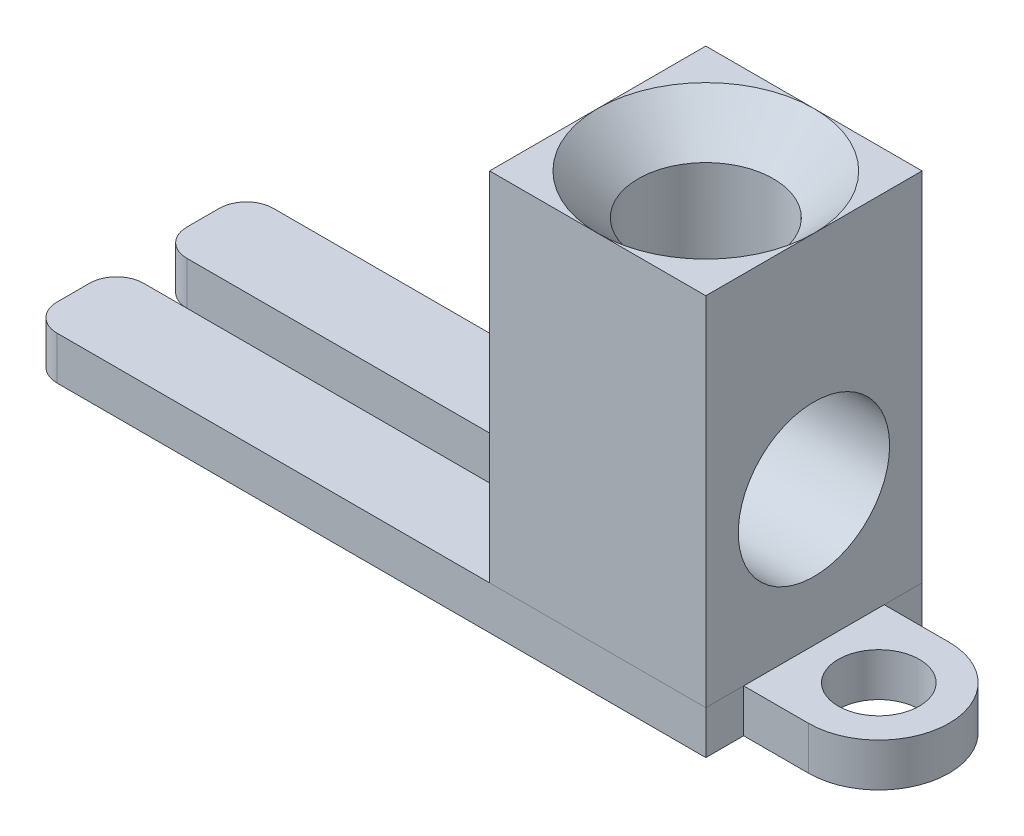
ISO-10303-21;
HEADER;
FILE_DESCRIPTION(('STEP AP214'),'2;1');
FILE_NAME('part.step','',(''),(''),'','','');
FILE_SCHEMA(('AUTOMOTIVE_DESIGN { 1 0 10303 214 1 1 1 1 }'));
ENDSEC;
DATA;
#1=APPLICATION_CONTEXT('core data for automotive mechanical design processes');
#2=APPLICATION_PROTOCOL_DEFINITION('international standard','automotive_design',2000,#1);
#3=PRODUCT_CONTEXT('',#1,'mechanical');
#4=PRODUCT('Part','Part','',(#3));
#5=PRODUCT_RELATED_PRODUCT_CATEGORY('part','',(#4));
#6=PRODUCT_DEFINITION_FORMATION('','',#4);
#7=PRODUCT_DEFINITION_CONTEXT('part definition',#1,'design');
#8=PRODUCT_DEFINITION('design','',#6,#7);
#9=PRODUCT_DEFINITION_SHAPE('','',#8);
#10=(LENGTH_UNIT() NAMED_UNIT(*) SI_UNIT(.MILLI.,.METRE.));
#11=(NAMED_UNIT(*) PLANE_ANGLE_UNIT() SI_UNIT($,.RADIAN.));
#12=(NAMED_UNIT(*) SI_UNIT($,.STERADIAN.) SOLID_ANGLE_UNIT());
#13=UNCERTAINTY_MEASURE_WITH_UNIT(LENGTH_MEASURE(1.E-05),#10,'distance_accuracy_value','');
#14=(GEOMETRIC_REPRESENTATION_CONTEXT(3) GLOBAL_UNCERTAINTY_ASSIGNED_CONTEXT((#13)) GLOBAL_UNIT_ASSIGNED_CONTEXT((#10,
#11,#12)) REPRESENTATION_CONTEXT('',''));
#15=CARTESIAN_POINT('',(0.,0.,0.));
#16=DIRECTION('',(0.,0.,1.));
#17=DIRECTION('',(1.,0.,0.));
#18=AXIS2_PLACEMENT_3D('',#15,#16,#17);
#19=CARTESIAN_POINT('',(-10.5,-0.8,-2.));
#20=DIRECTION('',(-1.,0.,0.));
#21=DIRECTION('',(0.,0.,1.));
#22=AXIS2_PLACEMENT_3D('',#19,#20,#21);
#23=PLANE('',#22);
#24=DIRECTION('',(0.,0.,1.));
#25=VECTOR('',#24,1.);
#26=CARTESIAN_POINT('',(-10.5,0.,-2.));
#27=LINE('',#26,#25);
#28=CARTESIAN_POINT('',(-10.5,0.,-1.5));
#29=VERTEX_POINT('',#28);
#30=CARTESIAN_POINT('',(-10.5,0.,-0.9));
#31=VERTEX_POINT('',#30);
#32=EDGE_CURVE('P0_E213',#29,#31,#27,.T.);
#33=ORIENTED_EDGE('',*,*,#32,.F.);
#34=DIRECTION('',(0.,1.,0.));
#35=VECTOR('',#34,1.);
#36=CARTESIAN_POINT('',(-10.5,-0.8,-1.5));
#37=LINE('',#36,#35);
#38=CARTESIAN_POINT('',(-10.5,-0.8,-1.5));
#39=VERTEX_POINT('',#38);
#40=EDGE_CURVE('P0_E25',#29,#39,#37,.F.);
#41=ORIENTED_EDGE('',*,*,#40,.T.);
#42=DIRECTION('',(0.,0.,1.));
#43=VECTOR('',#42,1.);
#44=CARTESIAN_POINT('',(-10.5,-0.8,-2.));
#45=LINE('',#44,#43);
#46=CARTESIAN_POINT('',(-10.5,-0.8,-0.9));
#47=VERTEX_POINT('',#46);
#48=EDGE_CURVE('P0_E189',#39,#47,#45,.T.);
#49=ORIENTED_EDGE('',*,*,#48,.T.);
#50=DIRECTION('',(0.,1.,0.));
#51=VECTOR('',#50,1.);
#52=CARTESIAN_POINT('',(-10.5,0.,-0.9));
#53=LINE('',#52,#51);
#54=EDGE_CURVE('P0_E255',#47,#31,#53,.T.);
#55=ORIENTED_EDGE('',*,*,#54,.T.);
#56=EDGE_LOOP('',(#33,#41,#49,#55));
#57=FACE_BOUND('',#56,.T.);
#58=ADVANCED_FACE('P0_F17',(#57),#23,.T.);
#59=CARTESIAN_POINT('',(2.,-0.8,1.3));
#60=DIRECTION('',(1.,0.,0.));
#61=DIRECTION('',(0.,0.,-1.));
#62=AXIS2_PLACEMENT_3D('',#59,#60,#61);
#63=PLANE('',#62);
#64=DIRECTION('',(0.,0.,-1.));
#65=VECTOR('',#64,1.);
#66=CARTESIAN_POINT('',(2.,0.,1.3));
#67=LINE('',#66,#65);
#68=CARTESIAN_POINT('',(2.,0.,2.));
#69=VERTEX_POINT('',#68);
#70=CARTESIAN_POINT('',(2.,0.,1.3));
#71=VERTEX_POINT('',#70);
#72=EDGE_CURVE('P0_E167',#69,#71,#67,.T.);
#73=ORIENTED_EDGE('',*,*,#72,.F.);
#74=DIRECTION('',(0.,1.,0.));
#75=VECTOR('',#74,1.);
#76=CARTESIAN_POINT('',(2.,-0.8,2.));
#77=LINE('',#76,#75);
#78=CARTESIAN_POINT('',(2.,-0.8,2.));
#79=VERTEX_POINT('',#78);
#80=EDGE_CURVE('P0_E217',#79,#69,#77,.T.);
#81=ORIENTED_EDGE('',*,*,#80,.F.);
#82=DIRECTION('',(0.,0.,-1.));
#83=VECTOR('',#82,1.);
#84=CARTESIAN_POINT('',(2.,-0.8,1.3));
#85=LINE('',#84,#83);
#86=CARTESIAN_POINT('',(2.,-0.8,1.3));
#87=VERTEX_POINT('',#86);
#88=EDGE_CURVE('P0_E170',#79,#87,#85,.T.);
#89=ORIENTED_EDGE('',*,*,#88,.T.);
#90=DIRECTION('',(0.,1.,0.));
#91=VECTOR('',#90,1.);
#92=CARTESIAN_POINT('',(2.,-0.8,1.3));
#93=LINE('',#92,#91);
#94=EDGE_CURVE('P0_E194',#87,#71,#93,.T.);
#95=ORIENTED_EDGE('',*,*,#94,.T.);
#96=EDGE_LOOP('',(#73,#81,#89,#95));
#97=FACE_BOUND('',#96,.T.);
#98=ADVANCED_FACE('P0_F291',(#97),#63,.T.);
#99=CARTESIAN_POINT('',(-10.5,-0.8,2.));
#100=DIRECTION('',(0.,0.,1.));
#101=DIRECTION('',(1.,0.,0.));
#102=AXIS2_PLACEMENT_3D('',#99,#100,#101);
#103=PLANE('',#102);
#104=DIRECTION('',(1.,0.,0.));
#105=VECTOR('',#104,1.);
#106=CARTESIAN_POINT('',(-10.5,0.,2.));
#107=LINE('',#106,#105);
#108=CARTESIAN_POINT('',(-10.,0.,2.));
#109=VERTEX_POINT('',#108);
#110=EDGE_CURVE('P0_E174',#109,#69,#107,.T.);
#111=ORIENTED_EDGE('',*,*,#110,.F.);
#112=DIRECTION('',(0.,1.,0.));
#113=VECTOR('',#112,1.);
#114=CARTESIAN_POINT('',(-10.,-0.8,2.));
#115=LINE('',#114,#113);
#116=CARTESIAN_POINT('',(-10.,-0.8,2.));
#117=VERTEX_POINT('',#116);
#118=EDGE_CURVE('P0_E242',#109,#117,#115,.F.);
#119=ORIENTED_EDGE('',*,*,#118,.T.);
#120=DIRECTION('',(1.,0.,0.));
#121=VECTOR('',#120,1.);
#122=CARTESIAN_POINT('',(-10.5,-0.8,2.));
#123=LINE('',#122,#121);
#124=EDGE_CURVE('P0_E192',#117,#79,#123,.T.);
#125=ORIENTED_EDGE('',*,*,#124,.T.);
#126=ORIENTED_EDGE('',*,*,#80,.T.);
#127=EDGE_LOOP('',(#111,#119,#125,#126));
#128=FACE_BOUND('',#127,.T.);
#129=ADVANCED_FACE('P0_F322',(#128),#103,.T.);
#130=CARTESIAN_POINT('',(-10.5,-0.8,0.9));
#131=VERTEX_POINT('',#130);
#132=CARTESIAN_POINT('',(-10.5,-0.8,1.5));
#133=VERTEX_POINT('',#132);
#134=EDGE_CURVE('P0_E188',#131,#133,#45,.T.);
#135=ORIENTED_EDGE('',*,*,#134,.T.);
#136=DIRECTION('',(0.,1.,0.));
#137=VECTOR('',#136,1.);
#138=CARTESIAN_POINT('',(-10.5,-0.8,1.5));
#139=LINE('',#138,#137);
#140=CARTESIAN_POINT('',(-10.5,0.,1.5));
#141=VERTEX_POINT('',#140);
#142=EDGE_CURVE('P0_E231',#133,#141,#139,.T.);
#143=ORIENTED_EDGE('',*,*,#142,.T.);
#144=CARTESIAN_POINT('',(-10.5,0.,0.9));
#145=VERTEX_POINT('',#144);
#146=EDGE_CURVE('P0_E212',#145,#141,#27,.T.);
#147=ORIENTED_EDGE('',*,*,#146,.F.);
#148=DIRECTION('',(0.,1.,0.));
#149=VECTOR('',#148,1.);
#150=CARTESIAN_POINT('',(-10.5,-0.8,0.9));
#151=LINE('',#150,#149);
#152=EDGE_CURVE('P0_E220',#145,#131,#151,.F.);
#153=ORIENTED_EDGE('',*,*,#152,.T.);
#154=EDGE_LOOP('',(#135,#143,#147,#153));
#155=FACE_BOUND('',#154,.T.);
#156=ADVANCED_FACE('P0_F302',(#155),#23,.T.);
#157=CARTESIAN_POINT('',(-10.5,-0.8,-2.));
#158=DIRECTION('',(0.,0.,-1.));
#159=DIRECTION('',(-1.,0.,0.));
#160=AXIS2_PLACEMENT_3D('',#157,#158,#159);
#161=PLANE('',#160);
#162=DIRECTION('',(-1.,0.,0.));
#163=VECTOR('',#162,1.);
#164=CARTESIAN_POINT('',(-10.5,-0.8,-2.));
#165=LINE('',#164,#163);
#166=CARTESIAN_POINT('',(2.,-0.8,-2.));
#167=VERTEX_POINT('',#166);
#168=CARTESIAN_POINT('',(-10.,-0.8,-2.));
#169=VERTEX_POINT('',#168);
#170=EDGE_CURVE('P0_E186',#167,#169,#165,.T.);
#171=ORIENTED_EDGE('',*,*,#170,.T.);
#172=DIRECTION('',(0.,1.,0.));
#173=VECTOR('',#172,1.);
#174=CARTESIAN_POINT('',(-10.,-0.8,-2.));
#175=LINE('',#174,#173);
#176=CARTESIAN_POINT('',(-10.,0.,-2.));
#177=VERTEX_POINT('',#176);
#178=EDGE_CURVE('P0_E252',#169,#177,#175,.T.);
#179=ORIENTED_EDGE('',*,*,#178,.T.);
#180=DIRECTION('',(-1.,0.,0.));
#181=VECTOR('',#180,1.);
#182=CARTESIAN_POINT('',(-10.5,0.,-2.));
#183=LINE('',#182,#181);
#184=CARTESIAN_POINT('',(2.,0.,-2.));
#185=VERTEX_POINT('',#184);
#186=EDGE_CURVE('P0_E209',#185,#177,#183,.T.);
#187=ORIENTED_EDGE('',*,*,#186,.F.);
#188=DIRECTION('',(0.,1.,0.));
#189=VECTOR('',#188,1.);
#190=CARTESIAN_POINT('',(2.,-0.8,-2.));
#191=LINE('',#190,#189);
#192=EDGE_CURVE('P0_E221',#167,#185,#191,.T.);
#193=ORIENTED_EDGE('',*,*,#192,.F.);
#194=EDGE_LOOP('',(#171,#179,#187,#193));
#195=FACE_BOUND('',#194,.T.);
#196=ADVANCED_FACE('P0_F267',(#195),#161,.T.);
#197=CARTESIAN_POINT('',(2.,-0.8,-2.));
#198=DIRECTION('',(1.,0.,0.));
#199=DIRECTION('',(0.,0.,-1.));
#200=AXIS2_PLACEMENT_3D('',#197,#198,#199);
#201=PLANE('',#200);
#202=DIRECTION('',(0.,0.,-1.));
#203=VECTOR('',#202,1.);
#204=CARTESIAN_POINT('',(2.,0.,-2.));
#205=LINE('',#204,#203);
#206=CARTESIAN_POINT('',(2.,0.,-1.3));
#207=VERTEX_POINT('',#206);
#208=EDGE_CURVE('P0_E206',#207,#185,#205,.T.);
#209=ORIENTED_EDGE('',*,*,#208,.F.);
#210=DIRECTION('',(0.,1.,0.));
#211=VECTOR('',#210,1.);
#212=CARTESIAN_POINT('',(2.,-0.8,-1.3));
#213=LINE('',#212,#211);
#214=CARTESIAN_POINT('',(2.,-0.8,-1.3));
#215=VERTEX_POINT('',#214);
#216=EDGE_CURVE('P0_E223',#215,#207,#213,.T.);
#217=ORIENTED_EDGE('',*,*,#216,.F.);
#218=DIRECTION('',(0.,0.,-1.));
#219=VECTOR('',#218,1.);
#220=CARTESIAN_POINT('',(2.,-0.8,-2.));
#221=LINE('',#220,#219);
#222=EDGE_CURVE('P0_E183',#215,#167,#221,.T.);
#223=ORIENTED_EDGE('',*,*,#222,.T.);
#224=ORIENTED_EDGE('',*,*,#192,.T.);
#225=EDGE_LOOP('',(#209,#217,#223,#224));
#226=FACE_BOUND('',#225,.T.);
#227=ADVANCED_FACE('P0_F275',(#226),#201,.T.);
#228=CARTESIAN_POINT('',(2.,-0.8,-1.3));
#229=DIRECTION('',(0.,0.,-1.));
#230=DIRECTION('',(-1.,0.,0.));
#231=AXIS2_PLACEMENT_3D('',#228,#229,#230);
#232=PLANE('',#231);
#233=DIRECTION('',(-1.,0.,0.));
#234=VECTOR('',#233,1.);
#235=CARTESIAN_POINT('',(2.,0.,-1.3));
#236=LINE('',#235,#234);
#237=CARTESIAN_POINT('',(3.2,0.,-1.3));
#238=VERTEX_POINT('',#237);
#239=EDGE_CURVE('P0_E203',#238,#207,#236,.T.);
#240=ORIENTED_EDGE('',*,*,#239,.F.);
#241=DIRECTION('',(0.,1.,0.));
#242=VECTOR('',#241,1.);
#243=CARTESIAN_POINT('',(3.2,-0.8,-1.3));
#244=LINE('',#243,#242);
#245=CARTESIAN_POINT('',(3.2,-0.8,-1.3));
#246=VERTEX_POINT('',#245);
#247=EDGE_CURVE('P0_E225',#246,#238,#244,.T.);
#248=ORIENTED_EDGE('',*,*,#247,.F.);
#249=DIRECTION('',(-1.,0.,0.));
#250=VECTOR('',#249,1.);
#251=CARTESIAN_POINT('',(2.,-0.8,-1.3));
#252=LINE('',#251,#250);
#253=EDGE_CURVE('P0_E180',#246,#215,#252,.T.);
#254=ORIENTED_EDGE('',*,*,#253,.T.);
#255=ORIENTED_EDGE('',*,*,#216,.T.);
#256=EDGE_LOOP('',(#240,#248,#254,#255));
#257=FACE_BOUND('',#256,.T.);
#258=ADVANCED_FACE('P0_F280',(#257),#232,.T.);
#259=CARTESIAN_POINT('',(3.2,-0.8,0.));
#260=DIRECTION('',(0.,1.,0.));
#261=DIRECTION('',(0.,0.,1.));
#262=AXIS2_PLACEMENT_3D('',#259,#260,#261);
#263=CYLINDRICAL_SURFACE('',#262,1.3);
#264=CARTESIAN_POINT('',(3.2,0.,0.));
#265=DIRECTION('',(0.,1.,0.));
#266=DIRECTION('',(0.,0.,1.));
#267=AXIS2_PLACEMENT_3D('',#264,#265,#266);
#268=CIRCLE('',#267,1.3);
#269=CARTESIAN_POINT('',(3.2,0.,1.3));
#270=VERTEX_POINT('',#269);
#271=EDGE_CURVE('P0_E200',#270,#238,#268,.T.);
#272=ORIENTED_EDGE('',*,*,#271,.F.);
#273=DIRECTION('',(0.,1.,0.));
#274=VECTOR('',#273,1.);
#275=CARTESIAN_POINT('',(3.2,-0.8,1.3));
#276=LINE('',#275,#274);
#277=CARTESIAN_POINT('',(3.2,-0.8,1.3));
#278=VERTEX_POINT('',#277);
#279=EDGE_CURVE('P0_E227',#278,#270,#276,.T.);
#280=ORIENTED_EDGE('',*,*,#279,.F.);
#281=CARTESIAN_POINT('',(3.2,-0.8,0.));
#282=DIRECTION('',(0.,1.,0.));
#283=DIRECTION('',(0.,0.,1.));
#284=AXIS2_PLACEMENT_3D('',#281,#282,#283);
#285=CIRCLE('',#284,1.3);
#286=EDGE_CURVE('P0_E177',#278,#246,#285,.T.);
#287=ORIENTED_EDGE('',*,*,#286,.T.);
#288=ORIENTED_EDGE('',*,*,#247,.T.);
#289=EDGE_LOOP('',(#272,#280,#287,#288));
#290=FACE_BOUND('',#289,.T.);
#291=ADVANCED_FACE('P0_F283',(#290),#263,.T.);
#292=CARTESIAN_POINT('',(2.,-0.8,1.3));
#293=DIRECTION('',(0.,0.,1.));
#294=DIRECTION('',(1.,0.,0.));
#295=AXIS2_PLACEMENT_3D('',#292,#293,#294);
#296=PLANE('',#295);
#297=DIRECTION('',(1.,0.,0.));
#298=VECTOR('',#297,1.);
#299=CARTESIAN_POINT('',(2.,0.,1.3));
#300=LINE('',#299,#298);
#301=EDGE_CURVE('P0_E197',#71,#270,#300,.T.);
#302=ORIENTED_EDGE('',*,*,#301,.F.);
#303=ORIENTED_EDGE('',*,*,#94,.F.);
#304=DIRECTION('',(1.,0.,0.));
#305=VECTOR('',#304,1.);
#306=CARTESIAN_POINT('',(2.,-0.8,1.3));
#307=LINE('',#306,#305);
#308=EDGE_CURVE('P0_E173',#87,#278,#307,.T.);
#309=ORIENTED_EDGE('',*,*,#308,.T.);
#310=ORIENTED_EDGE('',*,*,#279,.T.);
#311=EDGE_LOOP('',(#302,#303,#309,#310));
#312=FACE_BOUND('',#311,.T.);
#313=ADVANCED_FACE('P0_F288',(#312),#296,.T.);
#314=CARTESIAN_POINT('',(3.2,-0.8,0.));
#315=DIRECTION('',(0.,1.,0.));
#316=DIRECTION('',(0.,0.,1.));
#317=AXIS2_PLACEMENT_3D('',#314,#315,#316);
#318=PLANE('',#317);
#319=CARTESIAN_POINT('',(3.2,-0.8,0.));
#320=DIRECTION('',(0.,1.,0.));
#321=DIRECTION('',(0.,0.,1.));
#322=AXIS2_PLACEMENT_3D('',#319,#320,#321);
#323=CIRCLE('',#322,0.749999999999998);
#324=CARTESIAN_POINT('',(3.2,-0.8,0.749999999999999));
#325=VERTEX_POINT('',#324);
#326=EDGE_CURVE('P0_E164',#325,#325,#323,.T.);
#327=ORIENTED_EDGE('',*,*,#326,.T.);
#328=EDGE_LOOP('',(#327));
#329=FACE_BOUND('',#328,.T.);
#330=ORIENTED_EDGE('',*,*,#124,.F.);
#331=CARTESIAN_POINT('',(-10.,-0.8,1.5));
#332=DIRECTION('',(0.,1.,0.));
#333=DIRECTION('',(0.,0.,1.));
#334=AXIS2_PLACEMENT_3D('',#331,#332,#333);
#335=CIRCLE('',#334,0.5);
#336=EDGE_CURVE('P0_E248',#117,#133,#335,.F.);
#337=ORIENTED_EDGE('',*,*,#336,.T.);
#338=ORIENTED_EDGE('',*,*,#134,.F.);
#339=CARTESIAN_POINT('',(-10.,-0.8,0.9));
#340=DIRECTION('',(0.,1.,0.));
#341=DIRECTION('',(0.,0.,1.));
#342=AXIS2_PLACEMENT_3D('',#339,#340,#341);
#343=CIRCLE('',#342,0.5);
#344=CARTESIAN_POINT('',(-10.,-0.8,0.4));
#345=VERTEX_POINT('',#344);
#346=EDGE_CURVE('P0_E32',#131,#345,#343,.F.);
#347=ORIENTED_EDGE('',*,*,#346,.T.);
#348=DIRECTION('',(1.,0.,0.));
#349=VECTOR('',#348,1.);
#350=CARTESIAN_POINT('',(-2.,-0.8,0.4));
#351=LINE('',#350,#349);
#352=CARTESIAN_POINT('',(-2.,-0.8,0.4));
#353=VERTEX_POINT('',#352);
#354=EDGE_CURVE('P0_E129',#345,#353,#351,.T.);
#355=ORIENTED_EDGE('',*,*,#354,.T.);
#356=DIRECTION('',(0.,0.,-1.));
#357=VECTOR('',#356,1.);
#358=CARTESIAN_POINT('',(-2.,-0.8,-0.4));
#359=LINE('',#358,#357);
#360=CARTESIAN_POINT('',(-2.,-0.8,-0.4));
#361=VERTEX_POINT('',#360);
#362=EDGE_CURVE('P0_E135',#353,#361,#359,.T.);
#363=ORIENTED_EDGE('',*,*,#362,.T.);
#364=DIRECTION('',(-1.,0.,0.));
#365=VECTOR('',#364,1.);
#366=CARTESIAN_POINT('',(-2.,-0.8,-0.4));
#367=LINE('',#366,#365);
#368=CARTESIAN_POINT('',(-10.,-0.8,-0.4));
#369=VERTEX_POINT('',#368);
#370=EDGE_CURVE('P0_E150',#361,#369,#367,.T.);
#371=ORIENTED_EDGE('',*,*,#370,.T.);
#372=CARTESIAN_POINT('',(-10.,-0.8,-0.9));
#373=DIRECTION('',(0.,1.,0.));
#374=DIRECTION('',(0.,0.,1.));
#375=AXIS2_PLACEMENT_3D('',#372,#373,#374);
#376=CIRCLE('',#375,0.5);
#377=EDGE_CURVE('P0_E244',#369,#47,#376,.F.);
#378=ORIENTED_EDGE('',*,*,#377,.T.);
#379=ORIENTED_EDGE('',*,*,#48,.F.);
#380=CARTESIAN_POINT('',(-10.,-0.8,-1.5));
#381=DIRECTION('',(0.,1.,0.));
#382=DIRECTION('',(0.,0.,1.));
#383=AXIS2_PLACEMENT_3D('',#380,#381,#382);
#384=CIRCLE('',#383,0.5);
#385=EDGE_CURVE('P0_E39',#39,#169,#384,.F.);
#386=ORIENTED_EDGE('',*,*,#385,.T.);
#387=ORIENTED_EDGE('',*,*,#170,.F.);
#388=ORIENTED_EDGE('',*,*,#222,.F.);
#389=ORIENTED_EDGE('',*,*,#253,.F.);
#390=ORIENTED_EDGE('',*,*,#286,.F.);
#391=ORIENTED_EDGE('',*,*,#308,.F.);
#392=ORIENTED_EDGE('',*,*,#88,.F.);
#393=EDGE_LOOP('',(#330,#337,#338,#347,#355,#363,#371,#378,#379,#386,#387,#388,#389,#390,#391,#392));
#394=FACE_BOUND('',#393,.T.);
#395=ADVANCED_FACE('P0_F132',(#329,#394),#318,.F.);
#396=CARTESIAN_POINT('',(3.2,0.,0.));
#397=DIRECTION('',(0.,1.,0.));
#398=DIRECTION('',(0.,0.,1.));
#399=AXIS2_PLACEMENT_3D('',#396,#397,#398);
#400=PLANE('',#399);
#401=ORIENTED_EDGE('',*,*,#146,.T.);
#402=CARTESIAN_POINT('',(-10.,0.,1.5));
#403=DIRECTION('',(0.,1.,0.));
#404=DIRECTION('',(0.,0.,1.));
#405=AXIS2_PLACEMENT_3D('',#402,#403,#404);
#406=CIRCLE('',#405,0.5);
#407=EDGE_CURVE('P0_E240',#141,#109,#406,.T.);
#408=ORIENTED_EDGE('',*,*,#407,.T.);
#409=ORIENTED_EDGE('',*,*,#110,.T.);
#410=ORIENTED_EDGE('',*,*,#72,.T.);
#411=ORIENTED_EDGE('',*,*,#301,.T.);
#412=ORIENTED_EDGE('',*,*,#271,.T.);
#413=ORIENTED_EDGE('',*,*,#239,.T.);
#414=ORIENTED_EDGE('',*,*,#208,.T.);
#415=ORIENTED_EDGE('',*,*,#186,.T.);
#416=CARTESIAN_POINT('',(-10.,0.,-1.5));
#417=DIRECTION('',(0.,1.,0.));
#418=DIRECTION('',(0.,0.,1.));
#419=AXIS2_PLACEMENT_3D('',#416,#417,#418);
#420=CIRCLE('',#419,0.5);
#421=EDGE_CURVE('P0_E236',#177,#29,#420,.T.);
#422=ORIENTED_EDGE('',*,*,#421,.T.);
#423=ORIENTED_EDGE('',*,*,#32,.T.);
#424=CARTESIAN_POINT('',(-10.,0.,-0.9));
#425=DIRECTION('',(0.,1.,0.));
#426=DIRECTION('',(0.,0.,1.));
#427=AXIS2_PLACEMENT_3D('',#424,#425,#426);
#428=CIRCLE('',#427,0.5);
#429=CARTESIAN_POINT('',(-10.,0.,-0.4));
#430=VERTEX_POINT('',#429);
#431=EDGE_CURVE('P0_E234',#31,#430,#428,.T.);
#432=ORIENTED_EDGE('',*,*,#431,.T.);
#433=DIRECTION('',(-1.,0.,0.));
#434=VECTOR('',#433,1.);
#435=CARTESIAN_POINT('',(-2.,0.,-0.4));
#436=LINE('',#435,#434);
#437=CARTESIAN_POINT('',(-2.,0.,-0.4));
#438=VERTEX_POINT('',#437);
#439=EDGE_CURVE('P0_E139',#438,#430,#436,.T.);
#440=ORIENTED_EDGE('',*,*,#439,.F.);
#441=DIRECTION('',(0.,0.,-1.));
#442=VECTOR('',#441,1.);
#443=CARTESIAN_POINT('',(-2.,0.,-0.4));
#444=LINE('',#443,#442);
#445=CARTESIAN_POINT('',(-2.,0.,0.4));
#446=VERTEX_POINT('',#445);
#447=EDGE_CURVE('P0_E158',#446,#438,#444,.T.);
#448=ORIENTED_EDGE('',*,*,#447,.F.);
#449=DIRECTION('',(1.,0.,0.));
#450=VECTOR('',#449,1.);
#451=CARTESIAN_POINT('',(-2.,0.,0.4));
#452=LINE('',#451,#450);
#453=CARTESIAN_POINT('',(-10.,0.,0.4));
#454=VERTEX_POINT('',#453);
#455=EDGE_CURVE('P0_E145',#454,#446,#452,.T.);
#456=ORIENTED_EDGE('',*,*,#455,.F.);
#457=CARTESIAN_POINT('',(-10.,0.,0.9));
#458=DIRECTION('',(0.,1.,0.));
#459=DIRECTION('',(0.,0.,1.));
#460=AXIS2_PLACEMENT_3D('',#457,#458,#459);
#461=CIRCLE('',#460,0.5);
#462=EDGE_CURVE('P0_E238',#454,#145,#461,.T.);
#463=ORIENTED_EDGE('',*,*,#462,.T.);
#464=EDGE_LOOP('',(#401,#408,#409,#410,#411,#412,#413,#414,#415,#422,#423,#432,#440,#448,#456,#463));
#465=FACE_BOUND('',#464,.T.);
#466=CARTESIAN_POINT('',(3.2,0.,0.));
#467=DIRECTION('',(0.,1.,0.));
#468=DIRECTION('',(0.,0.,1.));
#469=AXIS2_PLACEMENT_3D('',#466,#467,#468);
#470=CIRCLE('',#469,0.749999999999998);
#471=CARTESIAN_POINT('',(3.2,0.,0.749999999999999));
#472=VERTEX_POINT('',#471);
#473=EDGE_CURVE('P0_E162',#472,#472,#470,.T.);
#474=ORIENTED_EDGE('',*,*,#473,.F.);
#475=EDGE_LOOP('',(#474));
#476=FACE_BOUND('',#475,.T.);
#477=ADVANCED_FACE('P0_F270',(#465,#476),#400,.T.);
#478=CARTESIAN_POINT('',(3.2,-0.8,0.));
#479=DIRECTION('',(0.,1.,0.));
#480=DIRECTION('',(0.,0.,1.));
#481=AXIS2_PLACEMENT_3D('',#478,#479,#480);
#482=CYLINDRICAL_SURFACE('',#481,0.749999999999998);
#483=ORIENTED_EDGE('',*,*,#326,.F.);
#484=EDGE_LOOP('',(#483));
#485=FACE_BOUND('',#484,.T.);
#486=ORIENTED_EDGE('',*,*,#473,.T.);
#487=EDGE_LOOP('',(#486));
#488=FACE_BOUND('',#487,.T.);
#489=ADVANCED_FACE('P0_F338',(#485,#488),#482,.F.);
#490=CARTESIAN_POINT('',(-2.,-0.8,-0.4));
#491=DIRECTION('',(0.,0.,-1.));
#492=DIRECTION('',(-1.,0.,0.));
#493=AXIS2_PLACEMENT_3D('',#490,#491,#492);
#494=PLANE('',#493);
#495=ORIENTED_EDGE('',*,*,#439,.T.);
#496=DIRECTION('',(0.,1.,0.));
#497=VECTOR('',#496,1.);
#498=CARTESIAN_POINT('',(-10.,-0.8,-0.4));
#499=LINE('',#498,#497);
#500=EDGE_CURVE('P0_E11',#430,#369,#499,.F.);
#501=ORIENTED_EDGE('',*,*,#500,.T.);
#502=ORIENTED_EDGE('',*,*,#370,.F.);
#503=DIRECTION('',(0.,1.,0.));
#504=VECTOR('',#503,1.);
#505=CARTESIAN_POINT('',(-2.,-0.8,-0.4));
#506=LINE('',#505,#504);
#507=EDGE_CURVE('P0_E149',#361,#438,#506,.T.);
#508=ORIENTED_EDGE('',*,*,#507,.T.);
#509=EDGE_LOOP('',(#495,#501,#502,#508));
#510=FACE_BOUND('',#509,.T.);
#511=ADVANCED_FACE('P0_F344',(#510),#494,.F.);
#512=CARTESIAN_POINT('',(-2.,-0.8,-0.4));
#513=DIRECTION('',(1.,0.,0.));
#514=DIRECTION('',(0.,0.,-1.));
#515=AXIS2_PLACEMENT_3D('',#512,#513,#514);
#516=PLANE('',#515);
#517=ORIENTED_EDGE('',*,*,#447,.T.);
#518=ORIENTED_EDGE('',*,*,#507,.F.);
#519=ORIENTED_EDGE('',*,*,#362,.F.);
#520=DIRECTION('',(0.,1.,0.));
#521=VECTOR('',#520,1.);
#522=CARTESIAN_POINT('',(-2.,-0.8,0.4));
#523=LINE('',#522,#521);
#524=EDGE_CURVE('P0_E142',#353,#446,#523,.T.);
#525=ORIENTED_EDGE('',*,*,#524,.T.);
#526=EDGE_LOOP('',(#517,#518,#519,#525));
#527=FACE_BOUND('',#526,.T.);
#528=ADVANCED_FACE('P0_F152',(#527),#516,.F.);
#529=CARTESIAN_POINT('',(-2.,-0.8,0.4));
#530=DIRECTION('',(0.,0.,1.));
#531=DIRECTION('',(1.,0.,0.));
#532=AXIS2_PLACEMENT_3D('',#529,#530,#531);
#533=PLANE('',#532);
#534=ORIENTED_EDGE('',*,*,#354,.F.);
#535=DIRECTION('',(0.,1.,0.));
#536=VECTOR('',#535,1.);
#537=CARTESIAN_POINT('',(-10.,0.,0.4));
#538=LINE('',#537,#536);
#539=EDGE_CURVE('P0_E250',#345,#454,#538,.T.);
#540=ORIENTED_EDGE('',*,*,#539,.T.);
#541=ORIENTED_EDGE('',*,*,#455,.T.);
#542=ORIENTED_EDGE('',*,*,#524,.F.);
#543=EDGE_LOOP('',(#534,#540,#541,#542));
#544=FACE_BOUND('',#543,.T.);
#545=ADVANCED_FACE('P0_F143',(#544),#533,.F.);
#546=CARTESIAN_POINT('',(-10.,-0.8,1.5));
#547=DIRECTION('',(0.,1.,0.));
#548=DIRECTION('',(0.,0.,1.));
#549=AXIS2_PLACEMENT_3D('',#546,#547,#548);
#550=CYLINDRICAL_SURFACE('',#549,0.5);
#551=ORIENTED_EDGE('',*,*,#336,.F.);
#552=ORIENTED_EDGE('',*,*,#118,.F.);
#553=ORIENTED_EDGE('',*,*,#407,.F.);
#554=ORIENTED_EDGE('',*,*,#142,.F.);
#555=EDGE_LOOP('',(#551,#552,#553,#554));
#556=FACE_BOUND('',#555,.T.);
#557=ADVANCED_FACE('P0_F299',(#556),#550,.T.);
#558=CARTESIAN_POINT('',(-10.,-0.8,0.9));
#559=DIRECTION('',(0.,-1.,0.));
#560=DIRECTION('',(0.,0.,-1.));
#561=AXIS2_PLACEMENT_3D('',#558,#559,#560);
#562=CYLINDRICAL_SURFACE('',#561,0.5);
#563=ORIENTED_EDGE('',*,*,#346,.F.);
#564=ORIENTED_EDGE('',*,*,#152,.F.);
#565=ORIENTED_EDGE('',*,*,#462,.F.);
#566=ORIENTED_EDGE('',*,*,#539,.F.);
#567=EDGE_LOOP('',(#563,#564,#565,#566));
#568=FACE_BOUND('',#567,.T.);
#569=ADVANCED_FACE('P0_F306',(#568),#562,.T.);
#570=CARTESIAN_POINT('',(-10.,-0.8,-1.5));
#571=DIRECTION('',(0.,1.,0.));
#572=DIRECTION('',(0.,0.,1.));
#573=AXIS2_PLACEMENT_3D('',#570,#571,#572);
#574=CYLINDRICAL_SURFACE('',#573,0.5);
#575=ORIENTED_EDGE('',*,*,#385,.F.);
#576=ORIENTED_EDGE('',*,*,#40,.F.);
#577=ORIENTED_EDGE('',*,*,#421,.F.);
#578=ORIENTED_EDGE('',*,*,#178,.F.);
#579=EDGE_LOOP('',(#575,#576,#577,#578));
#580=FACE_BOUND('',#579,.T.);
#581=ADVANCED_FACE('P0_F264',(#580),#574,.T.);
#582=CARTESIAN_POINT('',(-10.,-0.8,-0.9));
#583=DIRECTION('',(0.,-1.,0.));
#584=DIRECTION('',(0.,0.,-1.));
#585=AXIS2_PLACEMENT_3D('',#582,#583,#584);
#586=CYLINDRICAL_SURFACE('',#585,0.5);
#587=ORIENTED_EDGE('',*,*,#377,.F.);
#588=ORIENTED_EDGE('',*,*,#500,.F.);
#589=ORIENTED_EDGE('',*,*,#431,.F.);
#590=ORIENTED_EDGE('',*,*,#54,.F.);
#591=EDGE_LOOP('',(#587,#588,#589,#590));
#592=FACE_BOUND('',#591,.T.);
#593=ADVANCED_FACE('P0_F19',(#592),#586,.T.);
#594=CLOSED_SHELL('',(#58,#98,#129,#156,#196,#227,#258,#291,#313,#395,#477,#489,#511,#528,#545,
#557,#569,#581,#593));
#595=MANIFOLD_SOLID_BREP('P0_B1',#594);
#596=CARTESIAN_POINT('',(0.,6.6,0.));
#597=DIRECTION('',(0.,1.,0.));
#598=DIRECTION('',(0.,0.,1.));
#599=AXIS2_PLACEMENT_3D('',#596,#597,#598);
#600=PLANE('',#599);
#601=CARTESIAN_POINT('',(0.,6.6,0.));
#602=DIRECTION('',(0.,1.,0.));
#603=DIRECTION('',(0.,0.,1.));
#604=AXIS2_PLACEMENT_3D('',#601,#602,#603);
#605=CIRCLE('',#604,2.);
#606=CARTESIAN_POINT('',(0.,6.6,2.));
#607=VERTEX_POINT('',#606);
#608=CARTESIAN_POINT('',(2.,6.6,0.));
#609=VERTEX_POINT('',#608);
#610=EDGE_CURVE('P1_E28',#607,#609,#605,.T.);
#611=ORIENTED_EDGE('',*,*,#610,.F.);
#612=DIRECTION('',(1.,0.,0.));
#613=VECTOR('',#612,1.);
#614=CARTESIAN_POINT('',(-2.,6.6,2.));
#615=LINE('',#614,#613);
#616=CARTESIAN_POINT('',(2.,6.6,2.));
#617=VERTEX_POINT('',#616);
#618=EDGE_CURVE('P1_E42',#607,#617,#615,.T.);
#619=ORIENTED_EDGE('',*,*,#618,.T.);
#620=DIRECTION('',(0.,0.,-1.));
#621=VECTOR('',#620,1.);
#622=CARTESIAN_POINT('',(2.,6.6,-2.));
#623=LINE('',#622,#621);
#624=EDGE_CURVE('P1_E87',#617,#609,#623,.T.);
#625=ORIENTED_EDGE('',*,*,#624,.T.);
#626=EDGE_LOOP('',(#611,#619,#625));
#627=FACE_BOUND('',#626,.T.);
#628=ADVANCED_FACE('P1_F17',(#627),#600,.T.);
#629=CARTESIAN_POINT('',(0.,6.6,-2.));
#630=VERTEX_POINT('',#629);
#631=EDGE_CURVE('P1_E11',#609,#630,#605,.T.);
#632=ORIENTED_EDGE('',*,*,#631,.F.);
#633=CARTESIAN_POINT('',(2.,6.6,-2.));
#634=VERTEX_POINT('',#633);
#635=EDGE_CURVE('P1_E72',#609,#634,#623,.T.);
#636=ORIENTED_EDGE('',*,*,#635,.T.);
#637=DIRECTION('',(-1.,0.,0.));
#638=VECTOR('',#637,1.);
#639=CARTESIAN_POINT('',(-2.,6.6,-2.));
#640=LINE('',#639,#638);
#641=EDGE_CURVE('P1_E123',#634,#630,#640,.T.);
#642=ORIENTED_EDGE('',*,*,#641,.T.);
#643=EDGE_LOOP('',(#632,#636,#642));
#644=FACE_BOUND('',#643,.T.);
#645=ADVANCED_FACE('P1_F164',(#644),#600,.T.);
#646=CARTESIAN_POINT('',(-2.,6.6,0.));
#647=VERTEX_POINT('',#646);
#648=EDGE_CURVE('P1_E26',#630,#647,#605,.T.);
#649=ORIENTED_EDGE('',*,*,#648,.F.);
#650=CARTESIAN_POINT('',(-2.,6.6,-2.));
#651=VERTEX_POINT('',#650);
#652=EDGE_CURVE('P1_E132',#630,#651,#640,.T.);
#653=ORIENTED_EDGE('',*,*,#652,.T.);
#654=DIRECTION('',(0.,0.,1.));
#655=VECTOR('',#654,1.);
#656=CARTESIAN_POINT('',(-2.,6.6,-2.));
#657=LINE('',#656,#655);
#658=EDGE_CURVE('P1_E93',#651,#647,#657,.T.);
#659=ORIENTED_EDGE('',*,*,#658,.T.);
#660=EDGE_LOOP('',(#649,#653,#659));
#661=FACE_BOUND('',#660,.T.);
#662=ADVANCED_FACE('P1_F131',(#661),#600,.T.);
#663=CARTESIAN_POINT('',(2.,6.6,-2.));
#664=DIRECTION('',(-1.,0.,0.));
#665=DIRECTION('',(0.,0.,1.));
#666=AXIS2_PLACEMENT_3D('',#663,#664,#665);
#667=PLANE('',#666);
#668=CARTESIAN_POINT('',(2.,2.5,0.));
#669=DIRECTION('',(1.,0.,0.));
#670=DIRECTION('',(0.,0.,-1.));
#671=AXIS2_PLACEMENT_3D('',#668,#669,#670);
#672=CIRCLE('',#671,1.4);
#673=CARTESIAN_POINT('',(2.,2.5,-1.4));
#674=VERTEX_POINT('',#673);
#675=EDGE_CURVE('P1_E137',#674,#674,#672,.T.);
#676=ORIENTED_EDGE('',*,*,#675,.F.);
#677=EDGE_LOOP('',(#676));
#678=FACE_BOUND('',#677,.T.);
#679=DIRECTION('',(0.,0.,-1.));
#680=VECTOR('',#679,1.);
#681=CARTESIAN_POINT('',(2.,0.,-2.));
#682=LINE('',#681,#680);
#683=CARTESIAN_POINT('',(2.,0.,2.));
#684=VERTEX_POINT('',#683);
#685=CARTESIAN_POINT('',(2.,0.,-2.));
#686=VERTEX_POINT('',#685);
#687=EDGE_CURVE('P1_E103',#684,#686,#682,.T.);
#688=ORIENTED_EDGE('',*,*,#687,.T.);
#689=DIRECTION('',(0.,-1.,0.));
#690=VECTOR('',#689,1.);
#691=CARTESIAN_POINT('',(2.,6.6,-2.));
#692=LINE('',#691,#690);
#693=EDGE_CURVE('P1_E21',#634,#686,#692,.T.);
#694=ORIENTED_EDGE('',*,*,#693,.F.);
#695=ORIENTED_EDGE('',*,*,#635,.F.);
#696=ORIENTED_EDGE('',*,*,#624,.F.);
#697=DIRECTION('',(0.,-1.,0.));
#698=VECTOR('',#697,1.);
#699=CARTESIAN_POINT('',(2.,6.6,2.));
#700=LINE('',#699,#698);
#701=EDGE_CURVE('P1_E92',#617,#684,#700,.T.);
#702=ORIENTED_EDGE('',*,*,#701,.T.);
#703=EDGE_LOOP('',(#688,#694,#695,#696,#702));
#704=FACE_BOUND('',#703,.T.);
#705=ADVANCED_FACE('P1_F19',(#678,#704),#667,.F.);
#706=CARTESIAN_POINT('',(-2.,6.6,-2.));
#707=DIRECTION('',(0.,0.,1.));
#708=DIRECTION('',(1.,0.,0.));
#709=AXIS2_PLACEMENT_3D('',#706,#707,#708);
#710=PLANE('',#709);
#711=DIRECTION('',(-1.,0.,0.));
#712=VECTOR('',#711,1.);
#713=CARTESIAN_POINT('',(-2.,0.,-2.));
#714=LINE('',#713,#712);
#715=CARTESIAN_POINT('',(-2.,0.,-2.));
#716=VERTEX_POINT('',#715);
#717=EDGE_CURVE('P1_E106',#686,#716,#714,.T.);
#718=ORIENTED_EDGE('',*,*,#717,.T.);
#719=DIRECTION('',(0.,-1.,0.));
#720=VECTOR('',#719,1.);
#721=CARTESIAN_POINT('',(-2.,6.6,-2.));
#722=LINE('',#721,#720);
#723=EDGE_CURVE('P1_E112',#651,#716,#722,.T.);
#724=ORIENTED_EDGE('',*,*,#723,.F.);
#725=ORIENTED_EDGE('',*,*,#652,.F.);
#726=ORIENTED_EDGE('',*,*,#641,.F.);
#727=ORIENTED_EDGE('',*,*,#693,.T.);
#728=EDGE_LOOP('',(#718,#724,#725,#726,#727));
#729=FACE_BOUND('',#728,.T.);
#730=ADVANCED_FACE('P1_F121',(#729),#710,.F.);
#731=CARTESIAN_POINT('',(-2.,6.6,-2.));
#732=DIRECTION('',(1.,0.,0.));
#733=DIRECTION('',(0.,0.,-1.));
#734=AXIS2_PLACEMENT_3D('',#731,#732,#733);
#735=PLANE('',#734);
#736=CARTESIAN_POINT('',(-2.,2.5,0.));
#737=DIRECTION('',(1.,0.,0.));
#738=DIRECTION('',(0.,0.,-1.));
#739=AXIS2_PLACEMENT_3D('',#736,#737,#738);
#740=CIRCLE('',#739,1.4);
#741=CARTESIAN_POINT('',(-2.,2.5,-1.4));
#742=VERTEX_POINT('',#741);
#743=EDGE_CURVE('P1_E107',#742,#742,#740,.T.);
#744=ORIENTED_EDGE('',*,*,#743,.T.);
#745=EDGE_LOOP('',(#744));
#746=FACE_BOUND('',#745,.T.);
#747=DIRECTION('',(0.,0.,1.));
#748=VECTOR('',#747,1.);
#749=CARTESIAN_POINT('',(-2.,0.,-2.));
#750=LINE('',#749,#748);
#751=CARTESIAN_POINT('',(-2.,0.,2.));
#752=VERTEX_POINT('',#751);
#753=EDGE_CURVE('P1_E109',#716,#752,#750,.T.);
#754=ORIENTED_EDGE('',*,*,#753,.T.);
#755=DIRECTION('',(0.,-1.,0.));
#756=VECTOR('',#755,1.);
#757=CARTESIAN_POINT('',(-2.,6.6,2.));
#758=LINE('',#757,#756);
#759=CARTESIAN_POINT('',(-2.,6.6,2.));
#760=VERTEX_POINT('',#759);
#761=EDGE_CURVE('P1_E98',#760,#752,#758,.T.);
#762=ORIENTED_EDGE('',*,*,#761,.F.);
#763=EDGE_CURVE('P1_E96',#647,#760,#657,.T.);
#764=ORIENTED_EDGE('',*,*,#763,.F.);
#765=ORIENTED_EDGE('',*,*,#658,.F.);
#766=ORIENTED_EDGE('',*,*,#723,.T.);
#767=EDGE_LOOP('',(#754,#762,#764,#765,#766));
#768=FACE_BOUND('',#767,.T.);
#769=ADVANCED_FACE('P1_F128',(#746,#768),#735,.F.);
#770=CARTESIAN_POINT('',(-2.,6.6,2.));
#771=DIRECTION('',(0.,0.,-1.));
#772=DIRECTION('',(-1.,0.,0.));
#773=AXIS2_PLACEMENT_3D('',#770,#771,#772);
#774=PLANE('',#773);
#775=DIRECTION('',(1.,0.,0.));
#776=VECTOR('',#775,1.);
#777=CARTESIAN_POINT('',(-2.,0.,2.));
#778=LINE('',#777,#776);
#779=EDGE_CURVE('P1_E64',#752,#684,#778,.T.);
#780=ORIENTED_EDGE('',*,*,#779,.T.);
#781=ORIENTED_EDGE('',*,*,#701,.F.);
#782=ORIENTED_EDGE('',*,*,#618,.F.);
#783=EDGE_CURVE('P1_E91',#760,#607,#615,.T.);
#784=ORIENTED_EDGE('',*,*,#783,.F.);
#785=ORIENTED_EDGE('',*,*,#761,.T.);
#786=EDGE_LOOP('',(#780,#781,#782,#784,#785));
#787=FACE_BOUND('',#786,.T.);
#788=ADVANCED_FACE('P1_F90',(#787),#774,.F.);
#789=EDGE_CURVE('P1_E81',#647,#607,#605,.T.);
#790=ORIENTED_EDGE('',*,*,#789,.F.);
#791=ORIENTED_EDGE('',*,*,#763,.T.);
#792=ORIENTED_EDGE('',*,*,#783,.T.);
#793=EDGE_LOOP('',(#790,#791,#792));
#794=FACE_BOUND('',#793,.T.);
#795=ADVANCED_FACE('P1_F95',(#794),#600,.T.);
#796=CARTESIAN_POINT('',(0.,0.,0.));
#797=DIRECTION('',(0.,1.,0.));
#798=DIRECTION('',(0.,0.,1.));
#799=AXIS2_PLACEMENT_3D('',#796,#797,#798);
#800=PLANE('',#799);
#801=ORIENTED_EDGE('',*,*,#687,.F.);
#802=ORIENTED_EDGE('',*,*,#779,.F.);
#803=ORIENTED_EDGE('',*,*,#753,.F.);
#804=ORIENTED_EDGE('',*,*,#717,.F.);
#805=EDGE_LOOP('',(#801,#802,#803,#804));
#806=FACE_BOUND('',#805,.T.);
#807=ADVANCED_FACE('P1_F127',(#806),#800,.F.);
#808=CARTESIAN_POINT('',(-2.,2.5,0.));
#809=DIRECTION('',(1.,0.,0.));
#810=DIRECTION('',(0.,0.,-1.));
#811=AXIS2_PLACEMENT_3D('',#808,#809,#810);
#812=CYLINDRICAL_SURFACE('',#811,1.4);
#813=CARTESIAN_POINT('',(0.,3.13047601064593,1.25));
#814=CARTESIAN_POINT('',(0.0382914033586443,3.13047172640028,1.25000124449636));
#815=CARTESIAN_POINT('',(0.0765777004818178,3.13404251967174,1.24821892540852));
#816=CARTESIAN_POINT('',(0.151801704068977,3.14742423741934,1.24132780435685));
#817=CARTESIAN_POINT('',(0.188733449933321,3.15725989122157,1.23620581779665));
#818=CARTESIAN_POINT('',(0.277406173763263,3.18699461523157,1.22001369250822));
#819=CARTESIAN_POINT('',(0.327945198744011,3.20945096195066,1.20727913768111));
#820=CARTESIAN_POINT('',(0.42494974701935,3.25917110337675,1.17665653334209));
#821=CARTESIAN_POINT('',(0.471399384334546,3.28645250562305,1.1587494513436));
#822=CARTESIAN_POINT('',(0.553511743506079,3.33848026010289,1.12151897194257));
#823=CARTESIAN_POINT('',(0.589698386039484,3.36291465590356,1.10290258365258));
#824=CARTESIAN_POINT('',(0.659847294957215,3.41229361784028,1.06242316452454));
#825=CARTESIAN_POINT('',(0.693808205390144,3.43723848304128,1.04055818060518));
#826=CARTESIAN_POINT('',(0.792385975854767,3.51168147530337,0.970127576255163));
#827=CARTESIAN_POINT('',(0.853861577176749,3.56089926138135,0.916651619955864));
#828=CARTESIAN_POINT('',(0.953469067854883,3.64281743208856,0.810760382999212));
#829=CARTESIAN_POINT('',(0.993667529124867,3.67665291526125,0.761150361866221));
#830=CARTESIAN_POINT('',(1.06710743894285,3.73929275616413,0.654196443561565));
#831=CARTESIAN_POINT('',(1.1003609680996,3.76810583560351,0.59686626618324));
#832=CARTESIAN_POINT('',(1.1525733230873,3.81369666891938,0.486857486219282));
#833=CARTESIAN_POINT('',(1.17305294239356,3.83172434191069,0.435423600083037));
#834=CARTESIAN_POINT('',(1.20729822549178,3.86198530894496,0.328728430590488));
#835=CARTESIAN_POINT('',(1.22106787176671,3.87422203988566,0.273469439797152));
#836=CARTESIAN_POINT('',(1.24103391818331,3.89199292333045,0.160183472827446));
#837=CARTESIAN_POINT('',(1.24718630433585,3.8974881203103,0.102142404270043));
#838=CARTESIAN_POINT('',(1.2512754441944,3.90113852664052,-0.0144560706445102));
#839=CARTESIAN_POINT('',(1.24921456101228,3.8992958472359,-0.0730133236482348));
#840=CARTESIAN_POINT('',(1.23763206297857,3.88896632718614,-0.183154886537647));
#841=CARTESIAN_POINT('',(1.22882683865439,3.88111753322941,-0.234878840693946));
#842=CARTESIAN_POINT('',(1.20516998238412,3.86011221360893,-0.335786977470305));
#843=CARTESIAN_POINT('',(1.19031693091473,3.84695444184841,-0.384970560767918));
#844=CARTESIAN_POINT('',(1.15428573678654,3.81521786076044,-0.482697293281563));
#845=CARTESIAN_POINT('',(1.13278560584965,3.7963645797923,-0.531030727262871));
#846=CARTESIAN_POINT('',(1.08479599852239,3.75464858590542,-0.623236066517156));
#847=CARTESIAN_POINT('',(1.0583052435735,3.73178484564231,-0.667106824042449));
#848=CARTESIAN_POINT('',(0.986156289505621,3.67024657096457,-0.771947081634623));
#849=CARTESIAN_POINT('',(0.937725096876118,3.62956219020811,-0.829840477855284));
#850=CARTESIAN_POINT('',(0.833018098286287,3.54426656156275,-0.934945280424212));
#851=CARTESIAN_POINT('',(0.776709121685883,3.49963901945557,-0.982109180361475));
#852=CARTESIAN_POINT('',(0.655630703502068,3.40865698042749,-1.06689217534322));
#853=CARTESIAN_POINT('',(0.590689692848188,3.36228681202795,-1.10425307193401));
#854=CARTESIAN_POINT('',(0.487276751125872,3.29640351322365,-1.15173041424882));
#855=CARTESIAN_POINT('',(0.451872123490126,3.27508822095125,-1.16611129041663));
#856=CARTESIAN_POINT('',(0.378722918924542,3.23484162801368,-1.19187765608899));
#857=CARTESIAN_POINT('',(0.340982567935123,3.21590619946052,-1.20326837049071));
#858=CARTESIAN_POINT('',(0.268863587269426,3.18476546860755,-1.22121653403381));
#859=CARTESIAN_POINT('',(0.234864711366702,3.17197253964494,-1.22824854861652));
#860=CARTESIAN_POINT('',(0.165104839747829,3.15089389538503,-1.23954892963005));
#861=CARTESIAN_POINT('',(0.129349889545166,3.14259375713124,-1.2438261481274));
#862=CARTESIAN_POINT('',(0.0562024209861155,3.13193743178652,-1.24927841931571));
#863=CARTESIAN_POINT('',(0.0187949228781467,3.12965764738584,-1.250413605934));
#864=CARTESIAN_POINT('',(-0.0557869057348456,3.13183686281426,-1.24931269872641));
#865=CARTESIAN_POINT('',(-0.092961004837845,3.1363017323663,-1.24707366839832));
#866=CARTESIAN_POINT('',(-0.171755980485157,3.15212265688191,-1.238879433652));
#867=CARTESIAN_POINT('',(-0.213103736034396,3.16449056776674,-1.23237401482609));
#868=CARTESIAN_POINT('',(-0.293219429330211,3.19431885124705,-1.21581652898876));
#869=CARTESIAN_POINT('',(-0.331976520786081,3.21179916479553,-1.20575054113208));
#870=CARTESIAN_POINT('',(-0.403861118971267,3.24814918833865,-1.1835074852511));
#871=CARTESIAN_POINT('',(-0.43718874503365,3.26678242244813,-1.17157562832231));
#872=CARTESIAN_POINT('',(-0.502009169843361,3.30550658874423,-1.14529883497249));
#873=CARTESIAN_POINT('',(-0.533500463396049,3.32559868726299,-1.13095195543781));
#874=CARTESIAN_POINT('',(-0.625570923363987,3.38697114045302,-1.08439263339925));
#875=CARTESIAN_POINT('',(-0.683698754485457,3.42932079464616,-1.04867682307322));
#876=CARTESIAN_POINT('',(-0.79854287876244,3.51671006345158,-0.96452776134492));
#877=CARTESIAN_POINT('',(-0.854713631943705,3.56167011339399,-0.91526830420018));
#878=CARTESIAN_POINT('',(-0.958805081218434,3.64714180260391,-0.805530929587424));
#879=CARTESIAN_POINT('',(-1.00674630523939,3.68766441642178,-0.745081731473651));
#880=CARTESIAN_POINT('',(-1.08020454927353,3.75063859135505,-0.63155295871635));
#881=CARTESIAN_POINT('',(-1.10824122233895,3.77497251842661,-0.581152289341837));
#882=CARTESIAN_POINT('',(-1.15770996412553,3.81819827831962,-0.475003583715122));
#883=CARTESIAN_POINT('',(-1.17914563630137,3.83709307996483,-0.41925848683379));
#884=CARTESIAN_POINT('',(-1.21426122929603,3.86816040565655,-0.302962927856035));
#885=CARTESIAN_POINT('',(-1.22787089347673,3.88027201027398,-0.242374332849015));
#886=CARTESIAN_POINT('',(-1.24590269488228,3.89633667091598,-0.118796342801712));
#887=CARTESIAN_POINT('',(-1.25033356975434,3.90029748597098,-0.0558092891839327));
#888=CARTESIAN_POINT('',(-1.24967381284388,3.8997090592209,0.061524118474167));
#889=CARTESIAN_POINT('',(-1.24578798217361,3.89623662366538,0.115888876740678));
#890=CARTESIAN_POINT('',(-1.2311471848079,3.88318918420628,0.222921068042812));
#891=CARTESIAN_POINT('',(-1.22039184974523,3.87361385304382,0.275588409897837));
#892=CARTESIAN_POINT('',(-1.19284172818609,3.84919651392738,0.377331160692387));
#893=CARTESIAN_POINT('',(-1.17611617686999,3.83441490698593,0.426440286386887));
#894=CARTESIAN_POINT('',(-1.13743680939653,3.80045272168725,0.520910009670557));
#895=CARTESIAN_POINT('',(-1.11548063005094,3.78127015512966,0.566268900396514));
#896=CARTESIAN_POINT('',(-1.05605788976326,3.72981460728889,0.672656551994464));
#897=CARTESIAN_POINT('',(-1.01609426803913,3.69557107754984,0.731341392693069));
#898=CARTESIAN_POINT('',(-0.928744313371238,3.62227211765273,0.839519194919253));
#899=CARTESIAN_POINT('',(-0.881340680503059,3.5832055189779,0.888990130337541));
#900=CARTESIAN_POINT('',(-0.779282441014957,3.50190084496077,0.97978835388943));
#901=CARTESIAN_POINT('',(-0.724494489222736,3.45961282447771,1.02091894149311));
#902=CARTESIAN_POINT('',(-0.608783266092395,3.37549744304343,1.09387901337848));
#903=CARTESIAN_POINT('',(-0.547868541258845,3.33366952826056,1.1257212189368));
#904=CARTESIAN_POINT('',(-0.445641810986771,3.27150443937466,1.16857474394004));
#905=CARTESIAN_POINT('',(-0.406693362763867,3.24945568884173,1.18274547307314));
#906=CARTESIAN_POINT('',(-0.325867393881983,3.2088464975148,1.20751700985524));
#907=CARTESIAN_POINT('',(-0.283991087678944,3.19028462202964,1.21811928718842));
#908=CARTESIAN_POINT('',(-0.20229410664868,3.16117655152276,1.23413600825497));
#909=CARTESIAN_POINT('',(-0.162826268768831,3.14993733465782,1.24001915527983));
#910=CARTESIAN_POINT('',(-0.0822310353259715,3.13460649158322,1.24794126955711));
#911=CARTESIAN_POINT('',(-0.0411125744775728,3.13048061053919,1.24999866381368));
#912=CARTESIAN_POINT('',(0.,3.13047601064593,1.25));
#913=B_SPLINE_CURVE_WITH_KNOTS('',3,(#813,#814,#815,#816,#817,#818,#819,#820,#821,#822,#823,
#824,#825,#826,#827,#828,#829,#830,#831,#832,#833,#834,#835,#836,#837,#838,#839,#840,#841,#842,
#843,#844,#845,#846,#847,#848,#849,#850,#851,#852,#853,#854,#855,#856,#857,#858,#859,#860,#861,
#862,#863,#864,#865,#866,#867,#868,#869,#870,#871,#872,#873,#874,#875,#876,#877,#878,#879,#880,
#881,#882,#883,#884,#885,#886,#887,#888,#889,#890,#891,#892,#893,#894,#895,#896,#897,#898,#899,
#900,#901,#902,#903,#904,#905,#906,#907,#908,#909,#910,#911,#912),.UNSPECIFIED.,.T.,.F.,(4,2,2,
2,2,2,2,2,2,2,2,2,2,2,2,2,2,2,2,2,2,2,2,2,2,2,2,2,2,2,2,2,2,2,2,2,2,2,2,2,2,2,2,2,2,2,2,2,2,4),
(0.,0.114692878167487,0.229841313872778,0.399133044672031,0.569055802778121,0.71127233447673,
0.853574716474219,1.13755184956108,1.35361023871497,1.5692896082112,1.74325685491376,
1.9171207229595,2.09198459079853,2.26679815065048,2.42524892228969,2.5837369063578,
2.7515934128577,2.91949298149596,3.17531368121348,3.43224592631142,3.69538709154212,
3.82650352960332,3.95738931124845,4.06808057635878,4.17841435562299,4.29014176840362,
4.40196647111011,4.53216729252868,4.66288289464787,4.78272675532571,4.90266750668186,
5.14271833919975,5.40329192124101,5.66320576712,5.85031250718715,6.03731692477391,
6.22597493709987,6.41445327583021,6.57748363361576,6.74052273440189,6.90172945886987,
7.06300915483236,7.29819269227665,7.53393142240913,7.77470969437894,8.01515663358751,
8.15575872352198,8.29630283474026,8.42004343098414,8.54318646263392),.UNSPECIFIED.);
#914=CARTESIAN_POINT('',(0.,3.13047601064593,1.25));
#915=VERTEX_POINT('',#914);
#916=EDGE_CURVE('P1_E140',#915,#915,#913,.T.);
#917=ORIENTED_EDGE('',*,*,#916,.T.);
#918=EDGE_LOOP('',(#917));
#919=FACE_BOUND('',#918,.T.);
#920=ORIENTED_EDGE('',*,*,#743,.F.);
#921=EDGE_LOOP('',(#920));
#922=FACE_BOUND('',#921,.T.);
#923=ORIENTED_EDGE('',*,*,#675,.T.);
#924=EDGE_LOOP('',(#923));
#925=FACE_BOUND('',#924,.T.);
#926=ADVANCED_FACE('P1_F154',(#919,#922,#925),#812,.F.);
#927=CARTESIAN_POINT('',(0.,6.6,0.));
#928=DIRECTION('',(0.,1.,0.));
#929=DIRECTION('',(0.,0.,1.));
#930=AXIS2_PLACEMENT_3D('',#927,#928,#929);
#931=CYLINDRICAL_SURFACE('',#930,1.25);
#932=ORIENTED_EDGE('',*,*,#916,.F.);
#933=EDGE_LOOP('',(#932));
#934=FACE_BOUND('',#933,.T.);
#935=CARTESIAN_POINT('',(0.,5.85,0.));
#936=DIRECTION('',(0.,1.,0.));
#937=DIRECTION('',(0.,0.,1.));
#938=AXIS2_PLACEMENT_3D('',#935,#936,#937);
#939=CIRCLE('',#938,1.25);
#940=CARTESIAN_POINT('',(0.,5.85,1.25));
#941=VERTEX_POINT('',#940);
#942=EDGE_CURVE('P1_E88',#941,#941,#939,.T.);
#943=ORIENTED_EDGE('',*,*,#942,.T.);
#944=EDGE_LOOP('',(#943));
#945=FACE_BOUND('',#944,.T.);
#946=ADVANCED_FACE('P1_F150',(#934,#945),#931,.F.);
#947=CARTESIAN_POINT('',(0.,6.6,0.));
#948=DIRECTION('',(0.,1.,0.));
#949=DIRECTION('',(0.,0.,1.));
#950=AXIS2_PLACEMENT_3D('',#947,#948,#949);
#951=CONICAL_SURFACE('',#950,2.,0.785398163397449);
#952=ORIENTED_EDGE('',*,*,#942,.F.);
#953=EDGE_LOOP('',(#952));
#954=FACE_BOUND('',#953,.T.);
#955=ORIENTED_EDGE('',*,*,#610,.T.);
#956=ORIENTED_EDGE('',*,*,#631,.T.);
#957=ORIENTED_EDGE('',*,*,#648,.T.);
#958=ORIENTED_EDGE('',*,*,#789,.T.);
#959=EDGE_LOOP('',(#955,#956,#957,#958));
#960=FACE_BOUND('',#959,.T.);
#961=ADVANCED_FACE('P1_F82',(#954,#960),#951,.F.);
#962=CLOSED_SHELL('',(#628,#645,#662,#705,#730,#769,#788,#795,#807,#926,#946,#961));
#963=MANIFOLD_SOLID_BREP('P1_B1',#962);
#964=ADVANCED_BREP_SHAPE_REPRESENTATION('',(#18,#595,#963),#14);
#965=SHAPE_DEFINITION_REPRESENTATION(#9,#964);
ENDSEC;
END-ISO-10303-21;
